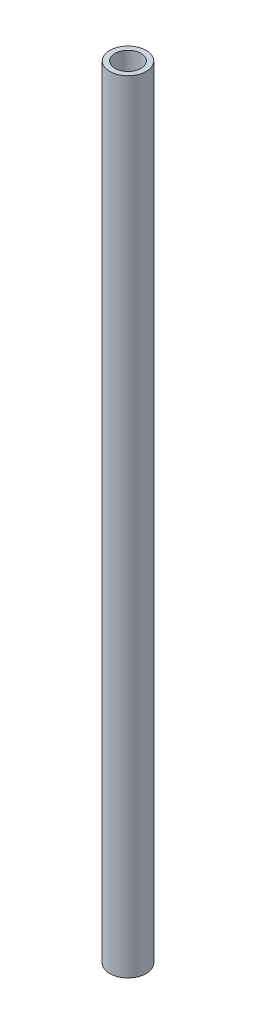
ISO-10303-21;
HEADER;
FILE_DESCRIPTION(('STEP AP214'),'2;1');
FILE_NAME('part.step','',(''),(''),'','','');
FILE_SCHEMA(('AUTOMOTIVE_DESIGN { 1 0 10303 214 1 1 1 1 }'));
ENDSEC;
DATA;
#1=APPLICATION_CONTEXT('core data for automotive mechanical design processes');
#2=APPLICATION_PROTOCOL_DEFINITION('international standard','automotive_design',2000,#1);
#3=PRODUCT_CONTEXT('',#1,'mechanical');
#4=PRODUCT('Part','Part','',(#3));
#5=PRODUCT_RELATED_PRODUCT_CATEGORY('part','',(#4));
#6=PRODUCT_DEFINITION_FORMATION('','',#4);
#7=PRODUCT_DEFINITION_CONTEXT('part definition',#1,'design');
#8=PRODUCT_DEFINITION('design','',#6,#7);
#9=PRODUCT_DEFINITION_SHAPE('','',#8);
#10=(LENGTH_UNIT() NAMED_UNIT(*) SI_UNIT(.MILLI.,.METRE.));
#11=(NAMED_UNIT(*) PLANE_ANGLE_UNIT() SI_UNIT($,.RADIAN.));
#12=(NAMED_UNIT(*) SI_UNIT($,.STERADIAN.) SOLID_ANGLE_UNIT());
#13=UNCERTAINTY_MEASURE_WITH_UNIT(LENGTH_MEASURE(1.E-05),#10,'distance_accuracy_value','');
#14=(GEOMETRIC_REPRESENTATION_CONTEXT(3) GLOBAL_UNCERTAINTY_ASSIGNED_CONTEXT((#13)) GLOBAL_UNIT_ASSIGNED_CONTEXT((#10,
#11,#12)) REPRESENTATION_CONTEXT('',''));
#15=CARTESIAN_POINT('',(0.,0.,0.));
#16=DIRECTION('',(0.,0.,1.));
#17=DIRECTION('',(1.,0.,0.));
#18=AXIS2_PLACEMENT_3D('',#15,#16,#17);
#19=CARTESIAN_POINT('',(0.,300.,0.));
#20=DIRECTION('',(0.,-1.,0.));
#21=DIRECTION('',(0.,0.,-1.));
#22=AXIS2_PLACEMENT_3D('',#19,#20,#21);
#23=CYLINDRICAL_SURFACE('',#22,4.);
#24=CARTESIAN_POINT('',(0.,31.,0.));
#25=DIRECTION('',(0.,1.,0.));
#26=DIRECTION('',(0.,0.,1.));
#27=AXIS2_PLACEMENT_3D('',#24,#25,#26);
#28=CIRCLE('',#27,4.);
#29=CARTESIAN_POINT('',(0.,31.,4.));
#30=VERTEX_POINT('',#29);
#31=EDGE_CURVE('E41',#30,#30,#28,.T.);
#32=ORIENTED_EDGE('',*,*,#31,.F.);
#33=EDGE_LOOP('',(#32));
#34=FACE_BOUND('',#33,.T.);
#35=CARTESIAN_POINT('',(0.,269.,0.));
#36=DIRECTION('',(0.,1.,0.));
#37=DIRECTION('',(0.,0.,1.));
#38=AXIS2_PLACEMENT_3D('',#35,#36,#37);
#39=CIRCLE('',#38,4.);
#40=CARTESIAN_POINT('',(0.,269.,4.));
#41=VERTEX_POINT('',#40);
#42=EDGE_CURVE('E52',#41,#41,#39,.T.);
#43=ORIENTED_EDGE('',*,*,#42,.T.);
#44=EDGE_LOOP('',(#43));
#45=FACE_BOUND('',#44,.T.);
#46=ADVANCED_FACE('F37',(#34,#45),#23,.F.);
#47=CARTESIAN_POINT('',(0.,300.,0.));
#48=DIRECTION('',(0.,1.,0.));
#49=DIRECTION('',(0.,0.,1.));
#50=AXIS2_PLACEMENT_3D('',#47,#48,#49);
#51=PLANE('',#50);
#52=CARTESIAN_POINT('',(0.,300.,0.));
#53=DIRECTION('',(0.,1.,0.));
#54=DIRECTION('',(0.,0.,1.));
#55=AXIS2_PLACEMENT_3D('',#52,#53,#54);
#56=CIRCLE('',#55,5.);
#57=CARTESIAN_POINT('',(0.,300.,5.));
#58=VERTEX_POINT('',#57);
#59=EDGE_CURVE('E55',#58,#58,#56,.T.);
#60=ORIENTED_EDGE('',*,*,#59,.F.);
#61=EDGE_LOOP('',(#60));
#62=FACE_BOUND('',#61,.T.);
#63=CARTESIAN_POINT('',(0.,300.,0.));
#64=DIRECTION('',(0.,1.,0.));
#65=DIRECTION('',(0.,0.,1.));
#66=AXIS2_PLACEMENT_3D('',#63,#64,#65);
#67=CIRCLE('',#66,7.);
#68=CARTESIAN_POINT('',(0.,300.,7.));
#69=VERTEX_POINT('',#68);
#70=EDGE_CURVE('E10',#69,#69,#67,.T.);
#71=ORIENTED_EDGE('',*,*,#70,.T.);
#72=EDGE_LOOP('',(#71));
#73=FACE_BOUND('',#72,.T.);
#74=ADVANCED_FACE('F86',(#62,#73),#51,.T.);
#75=CARTESIAN_POINT('',(0.,0.,0.));
#76=DIRECTION('',(0.,1.,0.));
#77=DIRECTION('',(0.,0.,1.));
#78=AXIS2_PLACEMENT_3D('',#75,#76,#77);
#79=PLANE('',#78);
#80=CARTESIAN_POINT('',(0.,0.,0.));
#81=DIRECTION('',(0.,1.,0.));
#82=DIRECTION('',(0.,0.,1.));
#83=AXIS2_PLACEMENT_3D('',#80,#81,#82);
#84=CIRCLE('',#83,5.);
#85=CARTESIAN_POINT('',(0.,0.,5.));
#86=VERTEX_POINT('',#85);
#87=EDGE_CURVE('E69',#86,#86,#84,.T.);
#88=ORIENTED_EDGE('',*,*,#87,.T.);
#89=EDGE_LOOP('',(#88));
#90=FACE_BOUND('',#89,.T.);
#91=CARTESIAN_POINT('',(0.,0.,0.));
#92=DIRECTION('',(0.,1.,0.));
#93=DIRECTION('',(0.,0.,1.));
#94=AXIS2_PLACEMENT_3D('',#91,#92,#93);
#95=CIRCLE('',#94,7.);
#96=CARTESIAN_POINT('',(0.,0.,7.));
#97=VERTEX_POINT('',#96);
#98=EDGE_CURVE('E46',#97,#97,#95,.T.);
#99=ORIENTED_EDGE('',*,*,#98,.F.);
#100=EDGE_LOOP('',(#99));
#101=FACE_BOUND('',#100,.T.);
#102=ADVANCED_FACE('F91',(#90,#101),#79,.F.);
#103=CARTESIAN_POINT('',(0.,300.,0.));
#104=DIRECTION('',(0.,-1.,0.));
#105=DIRECTION('',(0.,0.,-1.));
#106=AXIS2_PLACEMENT_3D('',#103,#104,#105);
#107=CYLINDRICAL_SURFACE('',#106,7.);
#108=ORIENTED_EDGE('',*,*,#70,.F.);
#109=EDGE_LOOP('',(#108));
#110=FACE_BOUND('',#109,.T.);
#111=ORIENTED_EDGE('',*,*,#98,.T.);
#112=EDGE_LOOP('',(#111));
#113=FACE_BOUND('',#112,.T.);
#114=ADVANCED_FACE('F39',(#110,#113),#107,.T.);
#115=CARTESIAN_POINT('',(0.,269.,0.));
#116=DIRECTION('',(0.,1.,0.));
#117=DIRECTION('',(0.,0.,1.));
#118=AXIS2_PLACEMENT_3D('',#115,#116,#117);
#119=CYLINDRICAL_SURFACE('',#118,5.);
#120=CARTESIAN_POINT('',(0.,269.,0.));
#121=DIRECTION('',(0.,1.,0.));
#122=DIRECTION('',(0.,0.,1.));
#123=AXIS2_PLACEMENT_3D('',#120,#121,#122);
#124=CIRCLE('',#123,5.);
#125=CARTESIAN_POINT('',(0.,269.,5.));
#126=VERTEX_POINT('',#125);
#127=EDGE_CURVE('E59',#126,#126,#124,.T.);
#128=ORIENTED_EDGE('',*,*,#127,.F.);
#129=EDGE_LOOP('',(#128));
#130=FACE_BOUND('',#129,.T.);
#131=ORIENTED_EDGE('',*,*,#59,.T.);
#132=EDGE_LOOP('',(#131));
#133=FACE_BOUND('',#132,.T.);
#134=ADVANCED_FACE('F95',(#130,#133),#119,.F.);
#135=CARTESIAN_POINT('',(0.,269.,0.));
#136=DIRECTION('',(0.,1.,0.));
#137=DIRECTION('',(0.,0.,1.));
#138=AXIS2_PLACEMENT_3D('',#135,#136,#137);
#139=PLANE('',#138);
#140=ORIENTED_EDGE('',*,*,#42,.F.);
#141=EDGE_LOOP('',(#140));
#142=FACE_BOUND('',#141,.T.);
#143=ORIENTED_EDGE('',*,*,#127,.T.);
#144=EDGE_LOOP('',(#143));
#145=FACE_BOUND('',#144,.T.);
#146=ADVANCED_FACE('F110',(#142,#145),#139,.T.);
#147=CARTESIAN_POINT('',(0.,31.,0.));
#148=DIRECTION('',(0.,-1.,0.));
#149=DIRECTION('',(0.,0.,-1.));
#150=AXIS2_PLACEMENT_3D('',#147,#148,#149);
#151=CYLINDRICAL_SURFACE('',#150,5.);
#152=CARTESIAN_POINT('',(0.,31.,0.));
#153=DIRECTION('',(0.,1.,0.));
#154=DIRECTION('',(0.,0.,1.));
#155=AXIS2_PLACEMENT_3D('',#152,#153,#154);
#156=CIRCLE('',#155,5.);
#157=CARTESIAN_POINT('',(0.,31.,5.));
#158=VERTEX_POINT('',#157);
#159=EDGE_CURVE('E73',#158,#158,#156,.T.);
#160=ORIENTED_EDGE('',*,*,#159,.T.);
#161=EDGE_LOOP('',(#160));
#162=FACE_BOUND('',#161,.T.);
#163=ORIENTED_EDGE('',*,*,#87,.F.);
#164=EDGE_LOOP('',(#163));
#165=FACE_BOUND('',#164,.T.);
#166=ADVANCED_FACE('F108',(#162,#165),#151,.F.);
#167=CARTESIAN_POINT('',(0.,31.,0.));
#168=DIRECTION('',(0.,1.,0.));
#169=DIRECTION('',(0.,0.,1.));
#170=AXIS2_PLACEMENT_3D('',#167,#168,#169);
#171=PLANE('',#170);
#172=ORIENTED_EDGE('',*,*,#31,.T.);
#173=EDGE_LOOP('',(#172));
#174=FACE_BOUND('',#173,.T.);
#175=ORIENTED_EDGE('',*,*,#159,.F.);
#176=EDGE_LOOP('',(#175));
#177=FACE_BOUND('',#176,.T.);
#178=ADVANCED_FACE('F82',(#174,#177),#171,.F.);
#179=CLOSED_SHELL('',(#46,#74,#102,#114,#134,#146,#166,#178));
#180=MANIFOLD_SOLID_BREP('B2',#179);
#181=ADVANCED_BREP_SHAPE_REPRESENTATION('',(#18,#180),#14);
#182=SHAPE_DEFINITION_REPRESENTATION(#9,#181);
ENDSEC;
END-ISO-10303-21;
